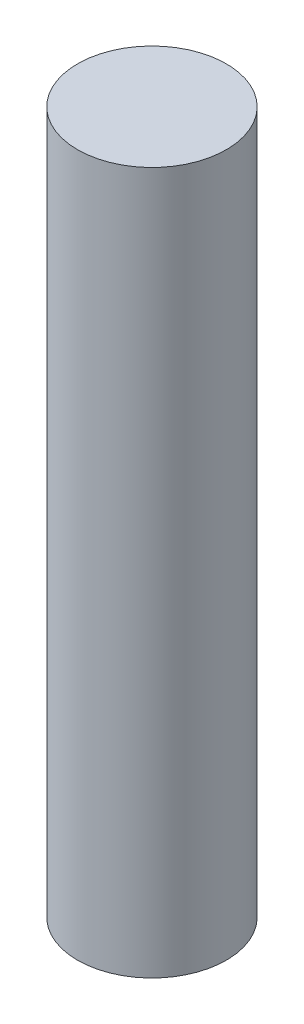
ISO-10303-21;
HEADER;
FILE_DESCRIPTION(('STEP AP214'),'2;1');
FILE_NAME('part.step','',(''),(''),'','','');
FILE_SCHEMA(('AUTOMOTIVE_DESIGN { 1 0 10303 214 1 1 1 1 }'));
ENDSEC;
DATA;
#1=APPLICATION_CONTEXT('core data for automotive mechanical design processes');
#2=APPLICATION_PROTOCOL_DEFINITION('international standard','automotive_design',2000,#1);
#3=PRODUCT_CONTEXT('',#1,'mechanical');
#4=PRODUCT('Part','Part','',(#3));
#5=PRODUCT_RELATED_PRODUCT_CATEGORY('part','',(#4));
#6=PRODUCT_DEFINITION_FORMATION('','',#4);
#7=PRODUCT_DEFINITION_CONTEXT('part definition',#1,'design');
#8=PRODUCT_DEFINITION('design','',#6,#7);
#9=PRODUCT_DEFINITION_SHAPE('','',#8);
#10=(LENGTH_UNIT() NAMED_UNIT(*) SI_UNIT(.MILLI.,.METRE.));
#11=(NAMED_UNIT(*) PLANE_ANGLE_UNIT() SI_UNIT($,.RADIAN.));
#12=(NAMED_UNIT(*) SI_UNIT($,.STERADIAN.) SOLID_ANGLE_UNIT());
#13=UNCERTAINTY_MEASURE_WITH_UNIT(LENGTH_MEASURE(1.E-05),#10,'distance_accuracy_value','');
#14=(GEOMETRIC_REPRESENTATION_CONTEXT(3) GLOBAL_UNCERTAINTY_ASSIGNED_CONTEXT((#13)) GLOBAL_UNIT_ASSIGNED_CONTEXT((#10,
#11,#12)) REPRESENTATION_CONTEXT('',''));
#15=CARTESIAN_POINT('',(0.,0.,0.));
#16=DIRECTION('',(0.,0.,1.));
#17=DIRECTION('',(1.,0.,0.));
#18=AXIS2_PLACEMENT_3D('',#15,#16,#17);
#19=CARTESIAN_POINT('',(-3.73159121285739,25.4,-8.1887696059926));
#20=DIRECTION('',(0.,-1.,0.));
#21=DIRECTION('',(0.,0.,-1.));
#22=AXIS2_PLACEMENT_3D('',#19,#20,#21);
#23=CYLINDRICAL_SURFACE('',#22,2.6924);
#24=CARTESIAN_POINT('',(-3.73159121285739,25.4,-8.1887696059926));
#25=DIRECTION('',(0.,1.,0.));
#26=DIRECTION('',(0.,0.,1.));
#27=AXIS2_PLACEMENT_3D('',#24,#25,#26);
#28=CIRCLE('',#27,2.6924);
#29=CARTESIAN_POINT('',(-3.73159121285739,25.4,-5.4963696059926));
#30=VERTEX_POINT('',#29);
#31=EDGE_CURVE('E10',#30,#30,#28,.T.);
#32=ORIENTED_EDGE('',*,*,#31,.F.);
#33=EDGE_LOOP('',(#32));
#34=FACE_BOUND('',#33,.T.);
#35=CARTESIAN_POINT('',(-3.73159121285739,0.,-8.1887696059926));
#36=DIRECTION('',(0.,1.,0.));
#37=DIRECTION('',(0.,0.,1.));
#38=AXIS2_PLACEMENT_3D('',#35,#36,#37);
#39=CIRCLE('',#38,2.6924);
#40=CARTESIAN_POINT('',(-3.73159121285739,0.,-5.4963696059926));
#41=VERTEX_POINT('',#40);
#42=EDGE_CURVE('E48',#41,#41,#39,.T.);
#43=ORIENTED_EDGE('',*,*,#42,.T.);
#44=EDGE_LOOP('',(#43));
#45=FACE_BOUND('',#44,.T.);
#46=ADVANCED_FACE('F44',(#34,#45),#23,.T.);
#47=CARTESIAN_POINT('',(-3.73159121285739,25.4,-8.1887696059926));
#48=DIRECTION('',(0.,1.,0.));
#49=DIRECTION('',(0.,0.,1.));
#50=AXIS2_PLACEMENT_3D('',#47,#48,#49);
#51=PLANE('',#50);
#52=ORIENTED_EDGE('',*,*,#31,.T.);
#53=EDGE_LOOP('',(#52));
#54=FACE_BOUND('',#53,.T.);
#55=ADVANCED_FACE('F64',(#54),#51,.T.);
#56=CARTESIAN_POINT('',(-3.73159121285739,0.,-8.1887696059926));
#57=DIRECTION('',(0.,1.,0.));
#58=DIRECTION('',(0.,0.,1.));
#59=AXIS2_PLACEMENT_3D('',#56,#57,#58);
#60=PLANE('',#59);
#61=ORIENTED_EDGE('',*,*,#42,.F.);
#62=EDGE_LOOP('',(#61));
#63=FACE_BOUND('',#62,.T.);
#64=ADVANCED_FACE('F58',(#63),#60,.F.);
#65=CLOSED_SHELL('',(#46,#55,#64));
#66=MANIFOLD_SOLID_BREP('B2',#65);
#67=ADVANCED_BREP_SHAPE_REPRESENTATION('',(#18,#66),#14);
#68=SHAPE_DEFINITION_REPRESENTATION(#9,#67);
ENDSEC;
END-ISO-10303-21;
